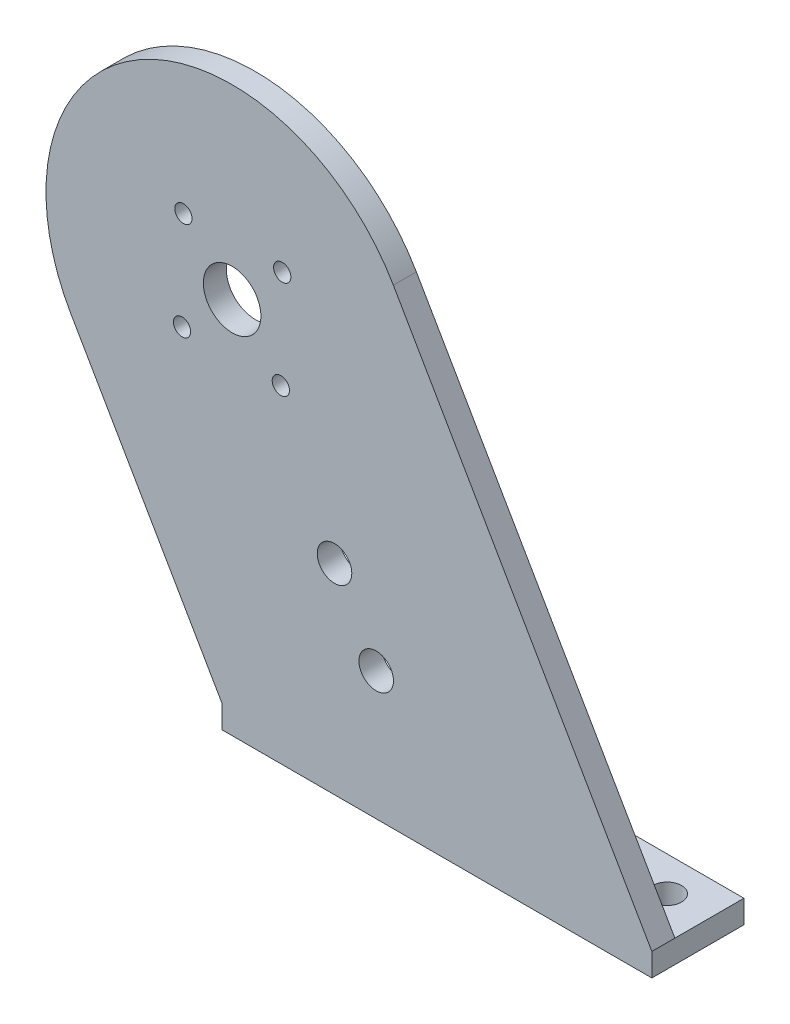
ISO-10303-21;
HEADER;
FILE_DESCRIPTION(('STEP AP214'),'2;1');
FILE_NAME('part.step','',(''),(''),'','','');
FILE_SCHEMA(('AUTOMOTIVE_DESIGN { 1 0 10303 214 1 1 1 1 }'));
ENDSEC;
DATA;
#1=APPLICATION_CONTEXT('core data for automotive mechanical design processes');
#2=APPLICATION_PROTOCOL_DEFINITION('international standard','automotive_design',2000,#1);
#3=PRODUCT_CONTEXT('',#1,'mechanical');
#4=PRODUCT('Part','Part','',(#3));
#5=PRODUCT_RELATED_PRODUCT_CATEGORY('part','',(#4));
#6=PRODUCT_DEFINITION_FORMATION('','',#4);
#7=PRODUCT_DEFINITION_CONTEXT('part definition',#1,'design');
#8=PRODUCT_DEFINITION('design','',#6,#7);
#9=PRODUCT_DEFINITION_SHAPE('','',#8);
#10=(LENGTH_UNIT() NAMED_UNIT(*) SI_UNIT(.MILLI.,.METRE.));
#11=(NAMED_UNIT(*) PLANE_ANGLE_UNIT() SI_UNIT($,.RADIAN.));
#12=(NAMED_UNIT(*) SI_UNIT($,.STERADIAN.) SOLID_ANGLE_UNIT());
#13=UNCERTAINTY_MEASURE_WITH_UNIT(LENGTH_MEASURE(1.E-05),#10,'distance_accuracy_value','');
#14=(GEOMETRIC_REPRESENTATION_CONTEXT(3) GLOBAL_UNCERTAINTY_ASSIGNED_CONTEXT((#13)) GLOBAL_UNIT_ASSIGNED_CONTEXT((#10,
#11,#12)) REPRESENTATION_CONTEXT('',''));
#15=CARTESIAN_POINT('',(0.,0.,0.));
#16=DIRECTION('',(0.,0.,1.));
#17=DIRECTION('',(1.,0.,0.));
#18=AXIS2_PLACEMENT_3D('',#15,#16,#17);
#19=CARTESIAN_POINT('',(0.,0.,0.));
#20=DIRECTION('',(0.,0.,1.));
#21=DIRECTION('',(1.,0.,0.));
#22=AXIS2_PLACEMENT_3D('',#19,#20,#21);
#23=PLANE('',#22);
#24=CARTESIAN_POINT('',(-21.3543288661853,15.9281025584274,0.));
#25=DIRECTION('',(0.,0.,1.));
#26=DIRECTION('',(1.,0.,0.));
#27=AXIS2_PLACEMENT_3D('',#24,#25,#26);
#28=CIRCLE('',#27,5.);
#29=CARTESIAN_POINT('',(-16.3543288661853,15.9281025584274,0.));
#30=VERTEX_POINT('',#29);
#31=EDGE_CURVE('E169',#30,#30,#28,.T.);
#32=ORIENTED_EDGE('',*,*,#31,.T.);
#33=EDGE_LOOP('',(#32));
#34=FACE_BOUND('',#33,.T.);
#35=CARTESIAN_POINT('',(-29.8169392027717,24.6329355886948,0.));
#36=DIRECTION('',(0.,0.,1.));
#37=DIRECTION('',(1.,0.,0.));
#38=AXIS2_PLACEMENT_3D('',#35,#36,#37);
#39=CIRCLE('',#38,1.5);
#40=CARTESIAN_POINT('',(-28.3169392027717,24.6329355886948,0.));
#41=VERTEX_POINT('',#40);
#42=EDGE_CURVE('E166',#41,#41,#39,.T.);
#43=ORIENTED_EDGE('',*,*,#42,.T.);
#44=EDGE_LOOP('',(#43));
#45=FACE_BOUND('',#44,.T.);
#46=CARTESIAN_POINT('',(-12.6494958359179,24.3907128950144,0.));
#47=DIRECTION('',(0.,0.,1.));
#48=DIRECTION('',(1.,0.,0.));
#49=AXIS2_PLACEMENT_3D('',#46,#47,#48);
#50=CIRCLE('',#49,1.5);
#51=CARTESIAN_POINT('',(-11.1494958359179,24.3907128950144,0.));
#52=VERTEX_POINT('',#51);
#53=EDGE_CURVE('E163',#52,#52,#50,.T.);
#54=ORIENTED_EDGE('',*,*,#53,.T.);
#55=EDGE_LOOP('',(#54));
#56=FACE_BOUND('',#55,.T.);
#57=CARTESIAN_POINT('',(-12.8917185295984,7.2232695281606,0.));
#58=DIRECTION('',(0.,0.,1.));
#59=DIRECTION('',(1.,0.,0.));
#60=AXIS2_PLACEMENT_3D('',#57,#58,#59);
#61=CIRCLE('',#60,1.5);
#62=CARTESIAN_POINT('',(-11.3917185295984,7.2232695281606,0.));
#63=VERTEX_POINT('',#62);
#64=EDGE_CURVE('E160',#63,#63,#61,.T.);
#65=ORIENTED_EDGE('',*,*,#64,.T.);
#66=EDGE_LOOP('',(#65));
#67=FACE_BOUND('',#66,.T.);
#68=CARTESIAN_POINT('',(-30.0591618964522,7.465492221841,0.));
#69=DIRECTION('',(0.,0.,1.));
#70=DIRECTION('',(1.,0.,0.));
#71=AXIS2_PLACEMENT_3D('',#68,#69,#70);
#72=CIRCLE('',#71,1.5);
#73=CARTESIAN_POINT('',(-28.5591618964522,7.465492221841,0.));
#74=VERTEX_POINT('',#73);
#75=EDGE_CURVE('E157',#74,#74,#72,.T.);
#76=ORIENTED_EDGE('',*,*,#75,.T.);
#77=EDGE_LOOP('',(#76));
#78=FACE_BOUND('',#77,.T.);
#79=CARTESIAN_POINT('',(-3.56777634287428,-14.8791101034397,0.));
#80=DIRECTION('',(0.,0.,1.));
#81=DIRECTION('',(1.,0.,0.));
#82=AXIS2_PLACEMENT_3D('',#79,#80,#81);
#83=CIRCLE('',#82,3.);
#84=CARTESIAN_POINT('',(-0.567776342874282,-14.8791101034397,0.));
#85=VERTEX_POINT('',#84);
#86=EDGE_CURVE('E154',#85,#85,#83,.T.);
#87=ORIENTED_EDGE('',*,*,#86,.T.);
#88=EDGE_LOOP('',(#87));
#89=FACE_BOUND('',#88,.T.);
#90=CARTESIAN_POINT('',(3.67591025866602,-27.4255433314134,0.));
#91=DIRECTION('',(0.,0.,1.));
#92=DIRECTION('',(1.,0.,0.));
#93=AXIS2_PLACEMENT_3D('',#90,#91,#92);
#94=CIRCLE('',#93,3.);
#95=CARTESIAN_POINT('',(6.67591025866602,-27.4255433314134,0.));
#96=VERTEX_POINT('',#95);
#97=EDGE_CURVE('E151',#96,#96,#94,.T.);
#98=ORIENTED_EDGE('',*,*,#97,.T.);
#99=EDGE_LOOP('',(#98));
#100=FACE_BOUND('',#99,.T.);
#101=DIRECTION('',(1.,0.,0.));
#102=VECTOR('',#101,1.);
#103=CARTESIAN_POINT('',(51.5597538847893,-45.6863227653068,0.));
#104=LINE('',#103,#102);
#105=CARTESIAN_POINT('',(-23.1222015239158,-45.6863227653069,0.));
#106=VERTEX_POINT('',#105);
#107=CARTESIAN_POINT('',(51.5597538847893,-45.6863227653068,0.));
#108=VERTEX_POINT('',#107);
#109=EDGE_CURVE('E77',#106,#108,#104,.T.);
#110=ORIENTED_EDGE('',*,*,#109,.F.);
#111=DIRECTION('',(0.5,-0.866025403784438,0.));
#112=VECTOR('',#111,1.);
#113=CARTESIAN_POINT('',(-37.1244092030624,-21.4337876468939,0.));
#114=LINE('',#113,#112);
#115=CARTESIAN_POINT('',(-49.3600621444497,-0.24101508863144,0.));
#116=VERTEX_POINT('',#115);
#117=EDGE_CURVE('E110',#116,#106,#114,.T.);
#118=ORIENTED_EDGE('',*,*,#117,.F.);
#119=CARTESIAN_POINT('',(-21.3543288661853,15.9281025584274,0.));
#120=DIRECTION('',(0.,0.,1.));
#121=DIRECTION('',(1.,0.,0.));
#122=AXIS2_PLACEMENT_3D('',#119,#120,#121);
#123=CIRCLE('',#122,32.3382352941176);
#124=CARTESIAN_POINT('',(6.65140441207909,32.0972202054862,0.));
#125=VERTEX_POINT('',#124);
#126=EDGE_CURVE('E69',#125,#116,#123,.T.);
#127=ORIENTED_EDGE('',*,*,#126,.F.);
#128=DIRECTION('',(0.5,-0.866025403784439,0.));
#129=VECTOR('',#128,1.);
#130=CARTESIAN_POINT('',(18.8870573534665,10.9044476472238,0.));
#131=LINE('',#130,#129);
#132=EDGE_CURVE('E146',#125,#108,#131,.T.);
#133=ORIENTED_EDGE('',*,*,#132,.T.);
#134=EDGE_LOOP('',(#110,#118,#127,#133));
#135=FACE_BOUND('',#134,.T.);
#136=ADVANCED_FACE('F38',(#34,#45,#56,#67,#78,#89,#100,#135),#23,.F.);
#137=CARTESIAN_POINT('',(51.5597538847892,0.,4.));
#138=DIRECTION('',(1.,0.,0.));
#139=DIRECTION('',(0.,1.,0.));
#140=AXIS2_PLACEMENT_3D('',#137,#138,#139);
#141=PLANE('',#140);
#142=DIRECTION('',(0.,0.,-1.));
#143=VECTOR('',#142,1.);
#144=CARTESIAN_POINT('',(51.5597538847893,-49.6863227653069,4.));
#145=LINE('',#144,#143);
#146=CARTESIAN_POINT('',(51.5597538847893,-49.6863227653069,4.));
#147=VERTEX_POINT('',#146);
#148=CARTESIAN_POINT('',(51.5597538847893,-49.6863227653069,-12.));
#149=VERTEX_POINT('',#148);
#150=EDGE_CURVE('E145',#147,#149,#145,.T.);
#151=ORIENTED_EDGE('',*,*,#150,.T.);
#152=DIRECTION('',(0.,-1.,0.));
#153=VECTOR('',#152,1.);
#154=CARTESIAN_POINT('',(51.5597538847893,-45.6863227653068,-12.));
#155=LINE('',#154,#153);
#156=CARTESIAN_POINT('',(51.5597538847893,-45.6863227653068,-12.));
#157=VERTEX_POINT('',#156);
#158=EDGE_CURVE('E189',#157,#149,#155,.T.);
#159=ORIENTED_EDGE('',*,*,#158,.F.);
#160=DIRECTION('',(0.,0.,1.));
#161=VECTOR('',#160,1.);
#162=CARTESIAN_POINT('',(51.5597538847893,-45.6863227653068,-12.));
#163=LINE('',#162,#161);
#164=EDGE_CURVE('E187',#157,#108,#163,.T.);
#165=ORIENTED_EDGE('',*,*,#164,.T.);
#166=DIRECTION('',(0.,0.,-1.));
#167=VECTOR('',#166,1.);
#168=CARTESIAN_POINT('',(51.5597538847893,-45.6863227653068,4.));
#169=LINE('',#168,#167);
#170=CARTESIAN_POINT('',(51.5597538847893,-45.6863227653068,4.));
#171=VERTEX_POINT('',#170);
#172=EDGE_CURVE('E11',#171,#108,#169,.T.);
#173=ORIENTED_EDGE('',*,*,#172,.F.);
#174=DIRECTION('',(0.,-1.,0.));
#175=VECTOR('',#174,1.);
#176=CARTESIAN_POINT('',(51.5597538847892,0.,4.));
#177=LINE('',#176,#175);
#178=EDGE_CURVE('E172',#171,#147,#177,.T.);
#179=ORIENTED_EDGE('',*,*,#178,.T.);
#180=EDGE_LOOP('',(#151,#159,#165,#173,#179));
#181=FACE_BOUND('',#180,.T.);
#182=ADVANCED_FACE('F40',(#181),#141,.T.);
#183=CARTESIAN_POINT('',(18.8870573534665,10.9044476472238,4.));
#184=DIRECTION('',(0.866025403784439,0.5,0.));
#185=DIRECTION('',(-0.5,0.866025403784439,0.));
#186=AXIS2_PLACEMENT_3D('',#183,#184,#185);
#187=PLANE('',#186);
#188=ORIENTED_EDGE('',*,*,#132,.F.);
#189=DIRECTION('',(0.,0.,-1.));
#190=VECTOR('',#189,1.);
#191=CARTESIAN_POINT('',(6.65140441207909,32.0972202054862,4.));
#192=LINE('',#191,#190);
#193=CARTESIAN_POINT('',(6.65140441207909,32.0972202054862,4.));
#194=VERTEX_POINT('',#193);
#195=EDGE_CURVE('E47',#194,#125,#192,.T.);
#196=ORIENTED_EDGE('',*,*,#195,.F.);
#197=DIRECTION('',(0.5,-0.866025403784439,0.));
#198=VECTOR('',#197,1.);
#199=CARTESIAN_POINT('',(18.8870573534665,10.9044476472238,4.));
#200=LINE('',#199,#198);
#201=EDGE_CURVE('E181',#194,#171,#200,.T.);
#202=ORIENTED_EDGE('',*,*,#201,.T.);
#203=ORIENTED_EDGE('',*,*,#172,.T.);
#204=EDGE_LOOP('',(#188,#196,#202,#203));
#205=FACE_BOUND('',#204,.T.);
#206=ADVANCED_FACE('F180',(#205),#187,.T.);
#207=CARTESIAN_POINT('',(-21.3543288661853,15.9281025584274,4.));
#208=DIRECTION('',(0.,0.,-1.));
#209=DIRECTION('',(-1.,0.,0.));
#210=AXIS2_PLACEMENT_3D('',#207,#208,#209);
#211=CYLINDRICAL_SURFACE('',#210,32.3382352941176);
#212=ORIENTED_EDGE('',*,*,#126,.T.);
#213=DIRECTION('',(0.,0.,-1.));
#214=VECTOR('',#213,1.);
#215=CARTESIAN_POINT('',(-49.3600621444497,-0.24101508863144,4.));
#216=LINE('',#215,#214);
#217=CARTESIAN_POINT('',(-49.3600621444497,-0.24101508863144,4.));
#218=VERTEX_POINT('',#217);
#219=EDGE_CURVE('E114',#218,#116,#216,.T.);
#220=ORIENTED_EDGE('',*,*,#219,.F.);
#221=CARTESIAN_POINT('',(-21.3543288661853,15.9281025584274,4.));
#222=DIRECTION('',(0.,0.,1.));
#223=DIRECTION('',(1.,0.,0.));
#224=AXIS2_PLACEMENT_3D('',#221,#222,#223);
#225=CIRCLE('',#224,32.3382352941176);
#226=EDGE_CURVE('E104',#194,#218,#225,.T.);
#227=ORIENTED_EDGE('',*,*,#226,.F.);
#228=ORIENTED_EDGE('',*,*,#195,.T.);
#229=EDGE_LOOP('',(#212,#220,#227,#228));
#230=FACE_BOUND('',#229,.T.);
#231=ADVANCED_FACE('F176',(#230),#211,.T.);
#232=CARTESIAN_POINT('',(-37.1244092030624,-21.4337876468939,4.));
#233=DIRECTION('',(0.866025403784438,0.5,0.));
#234=DIRECTION('',(-0.5,0.866025403784438,0.));
#235=AXIS2_PLACEMENT_3D('',#232,#233,#234);
#236=PLANE('',#235);
#237=ORIENTED_EDGE('',*,*,#117,.T.);
#238=DIRECTION('',(0.,0.,-1.));
#239=VECTOR('',#238,1.);
#240=CARTESIAN_POINT('',(-23.1222015239158,-45.6863227653069,4.));
#241=LINE('',#240,#239);
#242=CARTESIAN_POINT('',(-23.1222015239158,-45.6863227653069,4.));
#243=VERTEX_POINT('',#242);
#244=EDGE_CURVE('E108',#243,#106,#241,.T.);
#245=ORIENTED_EDGE('',*,*,#244,.F.);
#246=DIRECTION('',(0.5,-0.866025403784438,0.));
#247=VECTOR('',#246,1.);
#248=CARTESIAN_POINT('',(-37.1244092030624,-21.4337876468939,4.));
#249=LINE('',#248,#247);
#250=EDGE_CURVE('E95',#218,#243,#249,.T.);
#251=ORIENTED_EDGE('',*,*,#250,.F.);
#252=ORIENTED_EDGE('',*,*,#219,.T.);
#253=EDGE_LOOP('',(#237,#245,#251,#252));
#254=FACE_BOUND('',#253,.T.);
#255=ADVANCED_FACE('F109',(#254),#236,.F.);
#256=CARTESIAN_POINT('',(-23.1222015239155,1.20331877399409E-13,4.));
#257=DIRECTION('',(1.,0.,0.));
#258=DIRECTION('',(0.,1.,0.));
#259=AXIS2_PLACEMENT_3D('',#256,#257,#258);
#260=PLANE('',#259);
#261=ORIENTED_EDGE('',*,*,#244,.T.);
#262=DIRECTION('',(0.,0.,1.));
#263=VECTOR('',#262,1.);
#264=CARTESIAN_POINT('',(-23.1222015239158,-45.6863227653068,-12.));
#265=LINE('',#264,#263);
#266=CARTESIAN_POINT('',(-23.1222015239158,-45.6863227653068,-12.));
#267=VERTEX_POINT('',#266);
#268=EDGE_CURVE('E148',#267,#106,#265,.T.);
#269=ORIENTED_EDGE('',*,*,#268,.F.);
#270=DIRECTION('',(0.,1.,0.));
#271=VECTOR('',#270,1.);
#272=CARTESIAN_POINT('',(-23.1222015239158,-45.6863227653068,-12.));
#273=LINE('',#272,#271);
#274=CARTESIAN_POINT('',(-23.1222015239158,-49.6863227653069,-12.));
#275=VERTEX_POINT('',#274);
#276=EDGE_CURVE('E197',#275,#267,#273,.T.);
#277=ORIENTED_EDGE('',*,*,#276,.F.);
#278=DIRECTION('',(0.,0.,-1.));
#279=VECTOR('',#278,1.);
#280=CARTESIAN_POINT('',(-23.1222015239158,-49.6863227653069,4.));
#281=LINE('',#280,#279);
#282=CARTESIAN_POINT('',(-23.1222015239158,-49.6863227653069,4.));
#283=VERTEX_POINT('',#282);
#284=EDGE_CURVE('E115',#283,#275,#281,.T.);
#285=ORIENTED_EDGE('',*,*,#284,.F.);
#286=DIRECTION('',(0.,-1.,0.));
#287=VECTOR('',#286,1.);
#288=CARTESIAN_POINT('',(-23.1222015239155,1.20331877399409E-13,4.));
#289=LINE('',#288,#287);
#290=EDGE_CURVE('E100',#243,#283,#289,.T.);
#291=ORIENTED_EDGE('',*,*,#290,.F.);
#292=EDGE_LOOP('',(#261,#269,#277,#285,#291));
#293=FACE_BOUND('',#292,.T.);
#294=ADVANCED_FACE('F117',(#293),#260,.F.);
#295=CARTESIAN_POINT('',(-29.8169392027717,24.6329355886948,4.));
#296=DIRECTION('',(0.,0.,-1.));
#297=DIRECTION('',(-1.,0.,0.));
#298=AXIS2_PLACEMENT_3D('',#295,#296,#297);
#299=CYLINDRICAL_SURFACE('',#298,1.5);
#300=CARTESIAN_POINT('',(-29.8169392027717,24.6329355886948,4.));
#301=DIRECTION('',(0.,0.,1.));
#302=DIRECTION('',(1.,0.,0.));
#303=AXIS2_PLACEMENT_3D('',#300,#301,#302);
#304=CIRCLE('',#303,1.5);
#305=CARTESIAN_POINT('',(-28.3169392027717,24.6329355886948,4.));
#306=VERTEX_POINT('',#305);
#307=EDGE_CURVE('E139',#306,#306,#304,.T.);
#308=ORIENTED_EDGE('',*,*,#307,.T.);
#309=EDGE_LOOP('',(#308));
#310=FACE_BOUND('',#309,.T.);
#311=ORIENTED_EDGE('',*,*,#42,.F.);
#312=EDGE_LOOP('',(#311));
#313=FACE_BOUND('',#312,.T.);
#314=ADVANCED_FACE('F280',(#310,#313),#299,.F.);
#315=CARTESIAN_POINT('',(-12.6494958359179,24.3907128950144,4.));
#316=DIRECTION('',(0.,0.,-1.));
#317=DIRECTION('',(-1.,0.,0.));
#318=AXIS2_PLACEMENT_3D('',#315,#316,#317);
#319=CYLINDRICAL_SURFACE('',#318,1.5);
#320=CARTESIAN_POINT('',(-12.6494958359179,24.3907128950144,4.));
#321=DIRECTION('',(0.,0.,1.));
#322=DIRECTION('',(1.,0.,0.));
#323=AXIS2_PLACEMENT_3D('',#320,#321,#322);
#324=CIRCLE('',#323,1.5);
#325=CARTESIAN_POINT('',(-11.1494958359179,24.3907128950144,4.));
#326=VERTEX_POINT('',#325);
#327=EDGE_CURVE('E136',#326,#326,#324,.T.);
#328=ORIENTED_EDGE('',*,*,#327,.T.);
#329=EDGE_LOOP('',(#328));
#330=FACE_BOUND('',#329,.T.);
#331=ORIENTED_EDGE('',*,*,#53,.F.);
#332=EDGE_LOOP('',(#331));
#333=FACE_BOUND('',#332,.T.);
#334=ADVANCED_FACE('F283',(#330,#333),#319,.F.);
#335=CARTESIAN_POINT('',(-12.8917185295984,7.2232695281606,4.));
#336=DIRECTION('',(0.,0.,-1.));
#337=DIRECTION('',(-1.,0.,0.));
#338=AXIS2_PLACEMENT_3D('',#335,#336,#337);
#339=CYLINDRICAL_SURFACE('',#338,1.5);
#340=CARTESIAN_POINT('',(-12.8917185295984,7.2232695281606,4.));
#341=DIRECTION('',(0.,0.,1.));
#342=DIRECTION('',(1.,0.,0.));
#343=AXIS2_PLACEMENT_3D('',#340,#341,#342);
#344=CIRCLE('',#343,1.5);
#345=CARTESIAN_POINT('',(-11.3917185295984,7.2232695281606,4.));
#346=VERTEX_POINT('',#345);
#347=EDGE_CURVE('E133',#346,#346,#344,.T.);
#348=ORIENTED_EDGE('',*,*,#347,.T.);
#349=EDGE_LOOP('',(#348));
#350=FACE_BOUND('',#349,.T.);
#351=ORIENTED_EDGE('',*,*,#64,.F.);
#352=EDGE_LOOP('',(#351));
#353=FACE_BOUND('',#352,.T.);
#354=ADVANCED_FACE('F287',(#350,#353),#339,.F.);
#355=CARTESIAN_POINT('',(-30.0591618964522,7.465492221841,4.));
#356=DIRECTION('',(0.,0.,-1.));
#357=DIRECTION('',(-1.,0.,0.));
#358=AXIS2_PLACEMENT_3D('',#355,#356,#357);
#359=CYLINDRICAL_SURFACE('',#358,1.5);
#360=CARTESIAN_POINT('',(-30.0591618964522,7.465492221841,4.));
#361=DIRECTION('',(0.,0.,1.));
#362=DIRECTION('',(1.,0.,0.));
#363=AXIS2_PLACEMENT_3D('',#360,#361,#362);
#364=CIRCLE('',#363,1.5);
#365=CARTESIAN_POINT('',(-28.5591618964522,7.465492221841,4.));
#366=VERTEX_POINT('',#365);
#367=EDGE_CURVE('E130',#366,#366,#364,.T.);
#368=ORIENTED_EDGE('',*,*,#367,.T.);
#369=EDGE_LOOP('',(#368));
#370=FACE_BOUND('',#369,.T.);
#371=ORIENTED_EDGE('',*,*,#75,.F.);
#372=EDGE_LOOP('',(#371));
#373=FACE_BOUND('',#372,.T.);
#374=ADVANCED_FACE('F291',(#370,#373),#359,.F.);
#375=CARTESIAN_POINT('',(-3.56777634287428,-14.8791101034397,4.));
#376=DIRECTION('',(0.,0.,-1.));
#377=DIRECTION('',(-1.,0.,0.));
#378=AXIS2_PLACEMENT_3D('',#375,#376,#377);
#379=CYLINDRICAL_SURFACE('',#378,3.);
#380=CARTESIAN_POINT('',(-3.56777634287428,-14.8791101034397,4.));
#381=DIRECTION('',(0.,0.,1.));
#382=DIRECTION('',(1.,0.,0.));
#383=AXIS2_PLACEMENT_3D('',#380,#381,#382);
#384=CIRCLE('',#383,3.);
#385=CARTESIAN_POINT('',(-0.567776342874282,-14.8791101034397,4.));
#386=VERTEX_POINT('',#385);
#387=EDGE_CURVE('E127',#386,#386,#384,.T.);
#388=ORIENTED_EDGE('',*,*,#387,.T.);
#389=EDGE_LOOP('',(#388));
#390=FACE_BOUND('',#389,.T.);
#391=ORIENTED_EDGE('',*,*,#86,.F.);
#392=EDGE_LOOP('',(#391));
#393=FACE_BOUND('',#392,.T.);
#394=ADVANCED_FACE('F295',(#390,#393),#379,.F.);
#395=CARTESIAN_POINT('',(3.67591025866602,-27.4255433314134,4.));
#396=DIRECTION('',(0.,0.,-1.));
#397=DIRECTION('',(-1.,0.,0.));
#398=AXIS2_PLACEMENT_3D('',#395,#396,#397);
#399=CYLINDRICAL_SURFACE('',#398,3.);
#400=CARTESIAN_POINT('',(3.67591025866602,-27.4255433314134,4.));
#401=DIRECTION('',(0.,0.,1.));
#402=DIRECTION('',(1.,0.,0.));
#403=AXIS2_PLACEMENT_3D('',#400,#401,#402);
#404=CIRCLE('',#403,3.);
#405=CARTESIAN_POINT('',(6.67591025866602,-27.4255433314134,4.));
#406=VERTEX_POINT('',#405);
#407=EDGE_CURVE('E121',#406,#406,#404,.T.);
#408=ORIENTED_EDGE('',*,*,#407,.T.);
#409=EDGE_LOOP('',(#408));
#410=FACE_BOUND('',#409,.T.);
#411=ORIENTED_EDGE('',*,*,#97,.F.);
#412=EDGE_LOOP('',(#411));
#413=FACE_BOUND('',#412,.T.);
#414=ADVANCED_FACE('F299',(#410,#413),#399,.F.);
#415=CARTESIAN_POINT('',(0.,-49.6863227653069,4.));
#416=DIRECTION('',(0.,1.,0.));
#417=DIRECTION('',(0.,0.,1.));
#418=AXIS2_PLACEMENT_3D('',#415,#416,#417);
#419=PLANE('',#418);
#420=CARTESIAN_POINT('',(44.2187761804368,-49.6863227653069,-6.));
#421=DIRECTION('',(0.,1.,0.));
#422=DIRECTION('',(0.,0.,1.));
#423=AXIS2_PLACEMENT_3D('',#420,#421,#422);
#424=CIRCLE('',#423,2.5);
#425=CARTESIAN_POINT('',(44.2187761804368,-49.6863227653069,-3.5));
#426=VERTEX_POINT('',#425);
#427=EDGE_CURVE('E221',#426,#426,#424,.T.);
#428=ORIENTED_EDGE('',*,*,#427,.T.);
#429=EDGE_LOOP('',(#428));
#430=FACE_BOUND('',#429,.T.);
#431=CARTESIAN_POINT('',(-15.7812238195632,-49.6863227653069,-5.99999999999999));
#432=DIRECTION('',(0.,1.,0.));
#433=DIRECTION('',(0.,0.,-1.));
#434=AXIS2_PLACEMENT_3D('',#431,#432,#433);
#435=CIRCLE('',#434,2.5);
#436=CARTESIAN_POINT('',(-15.7812238195632,-49.6863227653069,-8.5));
#437=VERTEX_POINT('',#436);
#438=EDGE_CURVE('E227',#437,#437,#435,.T.);
#439=ORIENTED_EDGE('',*,*,#438,.T.);
#440=EDGE_LOOP('',(#439));
#441=FACE_BOUND('',#440,.T.);
#442=CARTESIAN_POINT('',(4.21877618043676,-49.6863227653069,-6.));
#443=DIRECTION('',(0.,1.,0.));
#444=DIRECTION('',(0.,0.,-1.));
#445=AXIS2_PLACEMENT_3D('',#442,#443,#444);
#446=CIRCLE('',#445,2.5);
#447=CARTESIAN_POINT('',(4.21877618043676,-49.6863227653069,-8.5));
#448=VERTEX_POINT('',#447);
#449=EDGE_CURVE('E228',#448,#448,#446,.T.);
#450=ORIENTED_EDGE('',*,*,#449,.T.);
#451=EDGE_LOOP('',(#450));
#452=FACE_BOUND('',#451,.T.);
#453=CARTESIAN_POINT('',(24.2187761804368,-49.6863227653069,-6.));
#454=DIRECTION('',(0.,1.,0.));
#455=DIRECTION('',(0.,0.,1.));
#456=AXIS2_PLACEMENT_3D('',#453,#454,#455);
#457=CIRCLE('',#456,2.5);
#458=CARTESIAN_POINT('',(24.2187761804368,-49.6863227653069,-3.5));
#459=VERTEX_POINT('',#458);
#460=EDGE_CURVE('E190',#459,#459,#457,.T.);
#461=ORIENTED_EDGE('',*,*,#460,.T.);
#462=EDGE_LOOP('',(#461));
#463=FACE_BOUND('',#462,.T.);
#464=ORIENTED_EDGE('',*,*,#284,.T.);
#465=DIRECTION('',(-1.,0.,0.));
#466=VECTOR('',#465,1.);
#467=CARTESIAN_POINT('',(51.5597538847893,-49.6863227653069,-12.));
#468=LINE('',#467,#466);
#469=EDGE_CURVE('E206',#149,#275,#468,.T.);
#470=ORIENTED_EDGE('',*,*,#469,.F.);
#471=ORIENTED_EDGE('',*,*,#150,.F.);
#472=DIRECTION('',(1.,0.,0.));
#473=VECTOR('',#472,1.);
#474=CARTESIAN_POINT('',(0.,-49.6863227653069,4.));
#475=LINE('',#474,#473);
#476=EDGE_CURVE('E55',#283,#147,#475,.T.);
#477=ORIENTED_EDGE('',*,*,#476,.F.);
#478=EDGE_LOOP('',(#464,#470,#471,#477));
#479=FACE_BOUND('',#478,.T.);
#480=ADVANCED_FACE('F207',(#430,#441,#452,#463,#479),#419,.F.);
#481=CARTESIAN_POINT('',(-21.3543288661853,15.9281025584274,4.));
#482=DIRECTION('',(0.,0.,-1.));
#483=DIRECTION('',(-1.,0.,0.));
#484=AXIS2_PLACEMENT_3D('',#481,#482,#483);
#485=CYLINDRICAL_SURFACE('',#484,5.);
#486=CARTESIAN_POINT('',(-21.3543288661853,15.9281025584274,4.));
#487=DIRECTION('',(0.,0.,1.));
#488=DIRECTION('',(1.,0.,0.));
#489=AXIS2_PLACEMENT_3D('',#486,#487,#488);
#490=CIRCLE('',#489,5.);
#491=CARTESIAN_POINT('',(-16.3543288661853,15.9281025584274,4.));
#492=VERTEX_POINT('',#491);
#493=EDGE_CURVE('E142',#492,#492,#490,.T.);
#494=ORIENTED_EDGE('',*,*,#493,.T.);
#495=EDGE_LOOP('',(#494));
#496=FACE_BOUND('',#495,.T.);
#497=ORIENTED_EDGE('',*,*,#31,.F.);
#498=EDGE_LOOP('',(#497));
#499=FACE_BOUND('',#498,.T.);
#500=ADVANCED_FACE('F276',(#496,#499),#485,.F.);
#501=CARTESIAN_POINT('',(0.,0.,4.));
#502=DIRECTION('',(0.,0.,1.));
#503=DIRECTION('',(1.,0.,0.));
#504=AXIS2_PLACEMENT_3D('',#501,#502,#503);
#505=PLANE('',#504);
#506=ORIENTED_EDGE('',*,*,#178,.F.);
#507=ORIENTED_EDGE('',*,*,#201,.F.);
#508=ORIENTED_EDGE('',*,*,#226,.T.);
#509=ORIENTED_EDGE('',*,*,#250,.T.);
#510=ORIENTED_EDGE('',*,*,#290,.T.);
#511=ORIENTED_EDGE('',*,*,#476,.T.);
#512=EDGE_LOOP('',(#506,#507,#508,#509,#510,#511));
#513=FACE_BOUND('',#512,.T.);
#514=ORIENTED_EDGE('',*,*,#407,.F.);
#515=EDGE_LOOP('',(#514));
#516=FACE_BOUND('',#515,.T.);
#517=ORIENTED_EDGE('',*,*,#387,.F.);
#518=EDGE_LOOP('',(#517));
#519=FACE_BOUND('',#518,.T.);
#520=ORIENTED_EDGE('',*,*,#367,.F.);
#521=EDGE_LOOP('',(#520));
#522=FACE_BOUND('',#521,.T.);
#523=ORIENTED_EDGE('',*,*,#347,.F.);
#524=EDGE_LOOP('',(#523));
#525=FACE_BOUND('',#524,.T.);
#526=ORIENTED_EDGE('',*,*,#327,.F.);
#527=EDGE_LOOP('',(#526));
#528=FACE_BOUND('',#527,.T.);
#529=ORIENTED_EDGE('',*,*,#307,.F.);
#530=EDGE_LOOP('',(#529));
#531=FACE_BOUND('',#530,.T.);
#532=ORIENTED_EDGE('',*,*,#493,.F.);
#533=EDGE_LOOP('',(#532));
#534=FACE_BOUND('',#533,.T.);
#535=ADVANCED_FACE('F97',(#513,#516,#519,#522,#525,#528,#531,#534),#505,.T.);
#536=CARTESIAN_POINT('',(51.5597538847893,-45.6863227653068,-12.));
#537=DIRECTION('',(0.,-1.,0.));
#538=DIRECTION('',(0.,0.,-1.));
#539=AXIS2_PLACEMENT_3D('',#536,#537,#538);
#540=PLANE('',#539);
#541=CARTESIAN_POINT('',(44.2187761804368,-45.6863227653068,-6.));
#542=DIRECTION('',(0.,1.,0.));
#543=DIRECTION('',(0.,0.,1.));
#544=AXIS2_PLACEMENT_3D('',#541,#542,#543);
#545=CIRCLE('',#544,2.5);
#546=CARTESIAN_POINT('',(44.2187761804368,-45.6863227653068,-3.5));
#547=VERTEX_POINT('',#546);
#548=EDGE_CURVE('E231',#547,#547,#545,.T.);
#549=ORIENTED_EDGE('',*,*,#548,.F.);
#550=EDGE_LOOP('',(#549));
#551=FACE_BOUND('',#550,.T.);
#552=CARTESIAN_POINT('',(-15.7812238195632,-45.6863227653068,-5.99999999999999));
#553=DIRECTION('',(0.,1.,0.));
#554=DIRECTION('',(0.,0.,-1.));
#555=AXIS2_PLACEMENT_3D('',#552,#553,#554);
#556=CIRCLE('',#555,2.5);
#557=CARTESIAN_POINT('',(-15.7812238195632,-45.6863227653068,-8.5));
#558=VERTEX_POINT('',#557);
#559=EDGE_CURVE('E224',#558,#558,#556,.T.);
#560=ORIENTED_EDGE('',*,*,#559,.F.);
#561=EDGE_LOOP('',(#560));
#562=FACE_BOUND('',#561,.T.);
#563=CARTESIAN_POINT('',(4.21877618043676,-45.6863227653068,-6.));
#564=DIRECTION('',(0.,1.,0.));
#565=DIRECTION('',(0.,0.,-1.));
#566=AXIS2_PLACEMENT_3D('',#563,#564,#565);
#567=CIRCLE('',#566,2.5);
#568=CARTESIAN_POINT('',(4.21877618043676,-45.6863227653068,-8.5));
#569=VERTEX_POINT('',#568);
#570=EDGE_CURVE('E236',#569,#569,#567,.T.);
#571=ORIENTED_EDGE('',*,*,#570,.F.);
#572=EDGE_LOOP('',(#571));
#573=FACE_BOUND('',#572,.T.);
#574=CARTESIAN_POINT('',(24.2187761804368,-45.6863227653068,-6.));
#575=DIRECTION('',(0.,1.,0.));
#576=DIRECTION('',(0.,0.,1.));
#577=AXIS2_PLACEMENT_3D('',#574,#575,#576);
#578=CIRCLE('',#577,2.5);
#579=CARTESIAN_POINT('',(24.2187761804368,-45.6863227653068,-3.5));
#580=VERTEX_POINT('',#579);
#581=EDGE_CURVE('E214',#580,#580,#578,.T.);
#582=ORIENTED_EDGE('',*,*,#581,.F.);
#583=EDGE_LOOP('',(#582));
#584=FACE_BOUND('',#583,.T.);
#585=ORIENTED_EDGE('',*,*,#109,.T.);
#586=ORIENTED_EDGE('',*,*,#164,.F.);
#587=DIRECTION('',(1.,0.,0.));
#588=VECTOR('',#587,1.);
#589=CARTESIAN_POINT('',(51.5597538847893,-45.6863227653068,-12.));
#590=LINE('',#589,#588);
#591=EDGE_CURVE('E193',#267,#157,#590,.T.);
#592=ORIENTED_EDGE('',*,*,#591,.F.);
#593=ORIENTED_EDGE('',*,*,#268,.T.);
#594=EDGE_LOOP('',(#585,#586,#592,#593));
#595=FACE_BOUND('',#594,.T.);
#596=ADVANCED_FACE('F185',(#551,#562,#573,#584,#595),#540,.F.);
#597=CARTESIAN_POINT('',(0.,0.,-12.));
#598=DIRECTION('',(0.,0.,-1.));
#599=DIRECTION('',(-1.,0.,0.));
#600=AXIS2_PLACEMENT_3D('',#597,#598,#599);
#601=PLANE('',#600);
#602=ORIENTED_EDGE('',*,*,#158,.T.);
#603=ORIENTED_EDGE('',*,*,#469,.T.);
#604=ORIENTED_EDGE('',*,*,#276,.T.);
#605=ORIENTED_EDGE('',*,*,#591,.T.);
#606=EDGE_LOOP('',(#602,#603,#604,#605));
#607=FACE_BOUND('',#606,.T.);
#608=ADVANCED_FACE('F211',(#607),#601,.T.);
#609=CARTESIAN_POINT('',(24.2187761804368,-49.6863227653069,-6.));
#610=DIRECTION('',(0.,1.,0.));
#611=DIRECTION('',(0.,0.,1.));
#612=AXIS2_PLACEMENT_3D('',#609,#610,#611);
#613=CYLINDRICAL_SURFACE('',#612,2.5);
#614=ORIENTED_EDGE('',*,*,#460,.F.);
#615=EDGE_LOOP('',(#614));
#616=FACE_BOUND('',#615,.T.);
#617=ORIENTED_EDGE('',*,*,#581,.T.);
#618=EDGE_LOOP('',(#617));
#619=FACE_BOUND('',#618,.T.);
#620=ADVANCED_FACE('F248',(#616,#619),#613,.F.);
#621=CARTESIAN_POINT('',(4.21877618043676,-49.6863227653069,-6.));
#622=DIRECTION('',(0.,1.,0.));
#623=DIRECTION('',(0.,0.,1.));
#624=AXIS2_PLACEMENT_3D('',#621,#622,#623);
#625=CYLINDRICAL_SURFACE('',#624,2.5);
#626=ORIENTED_EDGE('',*,*,#449,.F.);
#627=EDGE_LOOP('',(#626));
#628=FACE_BOUND('',#627,.T.);
#629=ORIENTED_EDGE('',*,*,#570,.T.);
#630=EDGE_LOOP('',(#629));
#631=FACE_BOUND('',#630,.T.);
#632=ADVANCED_FACE('F244',(#628,#631),#625,.F.);
#633=CARTESIAN_POINT('',(-15.7812238195632,-49.6863227653069,-5.99999999999999));
#634=DIRECTION('',(0.,1.,0.));
#635=DIRECTION('',(0.,0.,1.));
#636=AXIS2_PLACEMENT_3D('',#633,#634,#635);
#637=CYLINDRICAL_SURFACE('',#636,2.5);
#638=ORIENTED_EDGE('',*,*,#438,.F.);
#639=EDGE_LOOP('',(#638));
#640=FACE_BOUND('',#639,.T.);
#641=ORIENTED_EDGE('',*,*,#559,.T.);
#642=EDGE_LOOP('',(#641));
#643=FACE_BOUND('',#642,.T.);
#644=ADVANCED_FACE('F247',(#640,#643),#637,.F.);
#645=CARTESIAN_POINT('',(44.2187761804368,-49.6863227653069,-6.));
#646=DIRECTION('',(0.,1.,0.));
#647=DIRECTION('',(0.,0.,1.));
#648=AXIS2_PLACEMENT_3D('',#645,#646,#647);
#649=CYLINDRICAL_SURFACE('',#648,2.5);
#650=ORIENTED_EDGE('',*,*,#427,.F.);
#651=EDGE_LOOP('',(#650));
#652=FACE_BOUND('',#651,.T.);
#653=ORIENTED_EDGE('',*,*,#548,.T.);
#654=EDGE_LOOP('',(#653));
#655=FACE_BOUND('',#654,.T.);
#656=ADVANCED_FACE('F395',(#652,#655),#649,.F.);
#657=CLOSED_SHELL('',(#136,#182,#206,#231,#255,#294,#314,#334,#354,#374,#394,#414,#480,#500,
#535,#596,#608,#620,#632,#644,#656));
#658=MANIFOLD_SOLID_BREP('B2',#657);
#659=ADVANCED_BREP_SHAPE_REPRESENTATION('',(#18,#658),#14);
#660=SHAPE_DEFINITION_REPRESENTATION(#9,#659);
ENDSEC;
END-ISO-10303-21;
